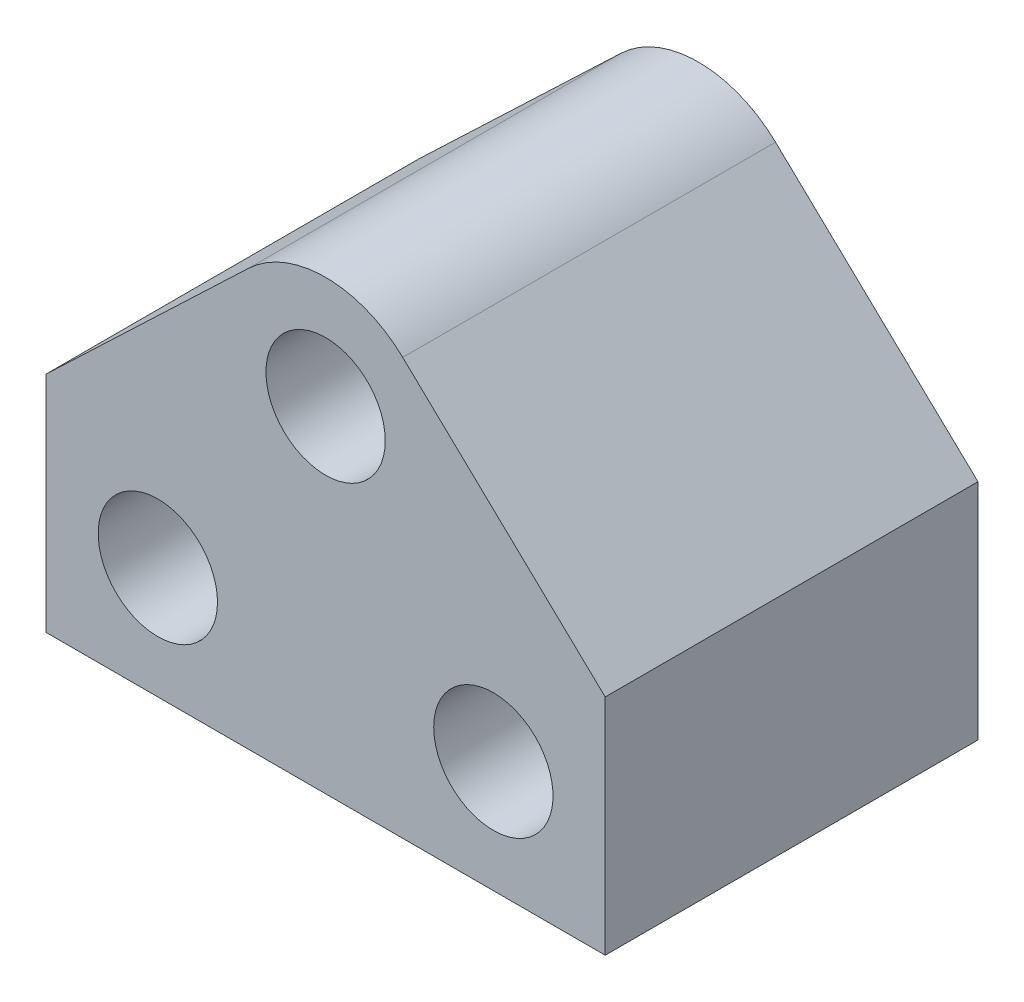
ISO-10303-21;
HEADER;
FILE_DESCRIPTION(('STEP AP214'),'2;1');
FILE_NAME('part.step','',(''),(''),'','','');
FILE_SCHEMA(('AUTOMOTIVE_DESIGN { 1 0 10303 214 1 1 1 1 }'));
ENDSEC;
DATA;
#1=APPLICATION_CONTEXT('core data for automotive mechanical design processes');
#2=APPLICATION_PROTOCOL_DEFINITION('international standard','automotive_design',2000,#1);
#3=PRODUCT_CONTEXT('',#1,'mechanical');
#4=PRODUCT('Part','Part','',(#3));
#5=PRODUCT_RELATED_PRODUCT_CATEGORY('part','',(#4));
#6=PRODUCT_DEFINITION_FORMATION('','',#4);
#7=PRODUCT_DEFINITION_CONTEXT('part definition',#1,'design');
#8=PRODUCT_DEFINITION('design','',#6,#7);
#9=PRODUCT_DEFINITION_SHAPE('','',#8);
#10=(LENGTH_UNIT() NAMED_UNIT(*) SI_UNIT(.MILLI.,.METRE.));
#11=(NAMED_UNIT(*) PLANE_ANGLE_UNIT() SI_UNIT($,.RADIAN.));
#12=(NAMED_UNIT(*) SI_UNIT($,.STERADIAN.) SOLID_ANGLE_UNIT());
#13=UNCERTAINTY_MEASURE_WITH_UNIT(LENGTH_MEASURE(1.E-05),#10,'distance_accuracy_value','');
#14=(GEOMETRIC_REPRESENTATION_CONTEXT(3) GLOBAL_UNCERTAINTY_ASSIGNED_CONTEXT((#13)) GLOBAL_UNIT_ASSIGNED_CONTEXT((#10,
#11,#12)) REPRESENTATION_CONTEXT('',''));
#15=CARTESIAN_POINT('',(0.,0.,0.));
#16=DIRECTION('',(0.,0.,1.));
#17=DIRECTION('',(1.,0.,0.));
#18=AXIS2_PLACEMENT_3D('',#15,#16,#17);
#19=CARTESIAN_POINT('',(0.,9.,10.));
#20=DIRECTION('',(0.,0.,-1.));
#21=DIRECTION('',(-1.,0.,0.));
#22=AXIS2_PLACEMENT_3D('',#19,#20,#21);
#23=PLANE('',#22);
#24=DIRECTION('',(0.,-1.,0.));
#25=VECTOR('',#24,1.);
#26=CARTESIAN_POINT('',(-7.49999999999999,0.,10.));
#27=LINE('',#26,#25);
#28=CARTESIAN_POINT('',(-7.49999999999999,6.,10.));
#29=VERTEX_POINT('',#28);
#30=CARTESIAN_POINT('',(-7.49999999999999,0.,10.));
#31=VERTEX_POINT('',#30);
#32=EDGE_CURVE('E152',#29,#31,#27,.T.);
#33=ORIENTED_EDGE('',*,*,#32,.T.);
#34=DIRECTION('',(1.,0.,0.));
#35=VECTOR('',#34,1.);
#36=CARTESIAN_POINT('',(7.50000000000001,0.,10.));
#37=LINE('',#36,#35);
#38=CARTESIAN_POINT('',(7.50000000000001,0.,10.));
#39=VERTEX_POINT('',#38);
#40=EDGE_CURVE('E100',#31,#39,#37,.T.);
#41=ORIENTED_EDGE('',*,*,#40,.T.);
#42=DIRECTION('',(0.,1.,0.));
#43=VECTOR('',#42,1.);
#44=CARTESIAN_POINT('',(7.50000000000001,0.,10.));
#45=LINE('',#44,#43);
#46=CARTESIAN_POINT('',(7.50000000000001,6.,10.));
#47=VERTEX_POINT('',#46);
#48=EDGE_CURVE('E113',#39,#47,#45,.T.);
#49=ORIENTED_EDGE('',*,*,#48,.T.);
#50=DIRECTION('',(-0.724137931034482,0.689655172413794,0.));
#51=VECTOR('',#50,1.);
#52=CARTESIAN_POINT('',(2.0689655172414,11.1724137931035,10.));
#53=LINE('',#52,#51);
#54=CARTESIAN_POINT('',(2.0689655172414,11.1724137931035,10.));
#55=VERTEX_POINT('',#54);
#56=EDGE_CURVE('E107',#47,#55,#53,.T.);
#57=ORIENTED_EDGE('',*,*,#56,.T.);
#58=CARTESIAN_POINT('',(0.,9.,10.));
#59=DIRECTION('',(0.,0.,1.));
#60=DIRECTION('',(-1.,0.,0.));
#61=AXIS2_PLACEMENT_3D('',#58,#59,#60);
#62=CIRCLE('',#61,3.00000000000001);
#63=CARTESIAN_POINT('',(-2.06896551724138,11.1724137931035,10.));
#64=VERTEX_POINT('',#63);
#65=EDGE_CURVE('E111',#55,#64,#62,.T.);
#66=ORIENTED_EDGE('',*,*,#65,.T.);
#67=DIRECTION('',(-0.724137931034482,-0.689655172413794,0.));
#68=VECTOR('',#67,1.);
#69=CARTESIAN_POINT('',(-7.49999999999999,6.,10.));
#70=LINE('',#69,#68);
#71=EDGE_CURVE('E63',#64,#29,#70,.T.);
#72=ORIENTED_EDGE('',*,*,#71,.T.);
#73=EDGE_LOOP('',(#33,#41,#49,#57,#66,#72));
#74=FACE_BOUND('',#73,.T.);
#75=CARTESIAN_POINT('',(-4.49999999999999,3.,10.));
#76=DIRECTION('',(0.,0.,1.));
#77=DIRECTION('',(1.,0.,0.));
#78=AXIS2_PLACEMENT_3D('',#75,#76,#77);
#79=CIRCLE('',#78,1.6);
#80=CARTESIAN_POINT('',(-2.89999999999999,3.,10.));
#81=VERTEX_POINT('',#80);
#82=EDGE_CURVE('E140',#81,#81,#79,.T.);
#83=ORIENTED_EDGE('',*,*,#82,.F.);
#84=EDGE_LOOP('',(#83));
#85=FACE_BOUND('',#84,.T.);
#86=CARTESIAN_POINT('',(0.,9.,10.));
#87=DIRECTION('',(0.,0.,1.));
#88=DIRECTION('',(1.,0.,0.));
#89=AXIS2_PLACEMENT_3D('',#86,#87,#88);
#90=CIRCLE('',#89,1.6);
#91=CARTESIAN_POINT('',(1.60000000000001,9.,10.));
#92=VERTEX_POINT('',#91);
#93=EDGE_CURVE('E212',#92,#92,#90,.T.);
#94=ORIENTED_EDGE('',*,*,#93,.F.);
#95=EDGE_LOOP('',(#94));
#96=FACE_BOUND('',#95,.T.);
#97=CARTESIAN_POINT('',(4.5,3.,10.));
#98=DIRECTION('',(0.,0.,1.));
#99=DIRECTION('',(-1.,0.,0.));
#100=AXIS2_PLACEMENT_3D('',#97,#98,#99);
#101=CIRCLE('',#100,1.6);
#102=CARTESIAN_POINT('',(2.9,3.,10.));
#103=VERTEX_POINT('',#102);
#104=EDGE_CURVE('E201',#103,#103,#101,.T.);
#105=ORIENTED_EDGE('',*,*,#104,.F.);
#106=EDGE_LOOP('',(#105));
#107=FACE_BOUND('',#106,.T.);
#108=ADVANCED_FACE('F45',(#74,#85,#96,#107),#23,.F.);
#109=CARTESIAN_POINT('',(0.,9.,0.));
#110=DIRECTION('',(0.,0.,-1.));
#111=DIRECTION('',(-1.,0.,0.));
#112=AXIS2_PLACEMENT_3D('',#109,#110,#111);
#113=PLANE('',#112);
#114=CARTESIAN_POINT('',(0.,9.,0.));
#115=DIRECTION('',(0.,0.,1.));
#116=DIRECTION('',(1.,0.,0.));
#117=AXIS2_PLACEMENT_3D('',#114,#115,#116);
#118=CIRCLE('',#117,1.6);
#119=CARTESIAN_POINT('',(1.60000000000001,9.,0.));
#120=VERTEX_POINT('',#119);
#121=EDGE_CURVE('E209',#120,#120,#118,.T.);
#122=ORIENTED_EDGE('',*,*,#121,.T.);
#123=EDGE_LOOP('',(#122));
#124=FACE_BOUND('',#123,.T.);
#125=DIRECTION('',(0.,-1.,0.));
#126=VECTOR('',#125,1.);
#127=CARTESIAN_POINT('',(-7.49999999999999,0.,0.));
#128=LINE('',#127,#126);
#129=CARTESIAN_POINT('',(-7.49999999999999,6.,0.));
#130=VERTEX_POINT('',#129);
#131=CARTESIAN_POINT('',(-7.49999999999999,0.,0.));
#132=VERTEX_POINT('',#131);
#133=EDGE_CURVE('E135',#130,#132,#128,.T.);
#134=ORIENTED_EDGE('',*,*,#133,.F.);
#135=DIRECTION('',(-0.724137931034482,-0.689655172413794,0.));
#136=VECTOR('',#135,1.);
#137=CARTESIAN_POINT('',(-7.49999999999999,6.,0.));
#138=LINE('',#137,#136);
#139=CARTESIAN_POINT('',(-2.06896551724138,11.1724137931035,0.));
#140=VERTEX_POINT('',#139);
#141=EDGE_CURVE('E92',#140,#130,#138,.T.);
#142=ORIENTED_EDGE('',*,*,#141,.F.);
#143=CARTESIAN_POINT('',(0.,9.,0.));
#144=DIRECTION('',(0.,0.,1.));
#145=DIRECTION('',(-1.,0.,0.));
#146=AXIS2_PLACEMENT_3D('',#143,#144,#145);
#147=CIRCLE('',#146,3.00000000000001);
#148=CARTESIAN_POINT('',(2.0689655172414,11.1724137931035,0.));
#149=VERTEX_POINT('',#148);
#150=EDGE_CURVE('E86',#149,#140,#147,.T.);
#151=ORIENTED_EDGE('',*,*,#150,.F.);
#152=DIRECTION('',(-0.724137931034482,0.689655172413794,0.));
#153=VECTOR('',#152,1.);
#154=CARTESIAN_POINT('',(2.0689655172414,11.1724137931035,0.));
#155=LINE('',#154,#153);
#156=CARTESIAN_POINT('',(7.50000000000001,6.,0.));
#157=VERTEX_POINT('',#156);
#158=EDGE_CURVE('E122',#157,#149,#155,.T.);
#159=ORIENTED_EDGE('',*,*,#158,.F.);
#160=DIRECTION('',(0.,1.,0.));
#161=VECTOR('',#160,1.);
#162=CARTESIAN_POINT('',(7.50000000000001,0.,0.));
#163=LINE('',#162,#161);
#164=CARTESIAN_POINT('',(7.50000000000001,0.,0.));
#165=VERTEX_POINT('',#164);
#166=EDGE_CURVE('E143',#165,#157,#163,.T.);
#167=ORIENTED_EDGE('',*,*,#166,.F.);
#168=DIRECTION('',(1.,0.,0.));
#169=VECTOR('',#168,1.);
#170=CARTESIAN_POINT('',(7.50000000000001,0.,0.));
#171=LINE('',#170,#169);
#172=EDGE_CURVE('E139',#132,#165,#171,.T.);
#173=ORIENTED_EDGE('',*,*,#172,.F.);
#174=EDGE_LOOP('',(#134,#142,#151,#159,#167,#173));
#175=FACE_BOUND('',#174,.T.);
#176=CARTESIAN_POINT('',(-4.49999999999999,3.,0.));
#177=DIRECTION('',(0.,0.,1.));
#178=DIRECTION('',(1.,0.,0.));
#179=AXIS2_PLACEMENT_3D('',#176,#177,#178);
#180=CIRCLE('',#179,1.6);
#181=CARTESIAN_POINT('',(-2.89999999999999,3.,0.));
#182=VERTEX_POINT('',#181);
#183=EDGE_CURVE('E216',#182,#182,#180,.T.);
#184=ORIENTED_EDGE('',*,*,#183,.T.);
#185=EDGE_LOOP('',(#184));
#186=FACE_BOUND('',#185,.T.);
#187=CARTESIAN_POINT('',(4.5,3.,0.));
#188=DIRECTION('',(0.,0.,1.));
#189=DIRECTION('',(-1.,0.,0.));
#190=AXIS2_PLACEMENT_3D('',#187,#188,#189);
#191=CIRCLE('',#190,1.6);
#192=CARTESIAN_POINT('',(2.9,3.,0.));
#193=VERTEX_POINT('',#192);
#194=EDGE_CURVE('E204',#193,#193,#191,.T.);
#195=ORIENTED_EDGE('',*,*,#194,.T.);
#196=EDGE_LOOP('',(#195));
#197=FACE_BOUND('',#196,.T.);
#198=ADVANCED_FACE('F165',(#124,#175,#186,#197),#113,.T.);
#199=CARTESIAN_POINT('',(-7.49999999999999,0.,10.));
#200=DIRECTION('',(1.,0.,0.));
#201=DIRECTION('',(0.,0.,-1.));
#202=AXIS2_PLACEMENT_3D('',#199,#200,#201);
#203=PLANE('',#202);
#204=ORIENTED_EDGE('',*,*,#133,.T.);
#205=DIRECTION('',(0.,0.,-1.));
#206=VECTOR('',#205,1.);
#207=CARTESIAN_POINT('',(-7.49999999999999,0.,10.));
#208=LINE('',#207,#206);
#209=EDGE_CURVE('E11',#31,#132,#208,.T.);
#210=ORIENTED_EDGE('',*,*,#209,.F.);
#211=ORIENTED_EDGE('',*,*,#32,.F.);
#212=DIRECTION('',(0.,0.,-1.));
#213=VECTOR('',#212,1.);
#214=CARTESIAN_POINT('',(-7.49999999999999,6.,10.));
#215=LINE('',#214,#213);
#216=EDGE_CURVE('E131',#29,#130,#215,.T.);
#217=ORIENTED_EDGE('',*,*,#216,.T.);
#218=EDGE_LOOP('',(#204,#210,#211,#217));
#219=FACE_BOUND('',#218,.T.);
#220=ADVANCED_FACE('F47',(#219),#203,.F.);
#221=CARTESIAN_POINT('',(7.50000000000001,0.,10.));
#222=DIRECTION('',(0.,1.,0.));
#223=DIRECTION('',(0.,0.,1.));
#224=AXIS2_PLACEMENT_3D('',#221,#222,#223);
#225=PLANE('',#224);
#226=ORIENTED_EDGE('',*,*,#172,.T.);
#227=DIRECTION('',(0.,0.,-1.));
#228=VECTOR('',#227,1.);
#229=CARTESIAN_POINT('',(7.50000000000001,0.,10.));
#230=LINE('',#229,#228);
#231=EDGE_CURVE('E55',#39,#165,#230,.T.);
#232=ORIENTED_EDGE('',*,*,#231,.F.);
#233=ORIENTED_EDGE('',*,*,#40,.F.);
#234=ORIENTED_EDGE('',*,*,#209,.T.);
#235=EDGE_LOOP('',(#226,#232,#233,#234));
#236=FACE_BOUND('',#235,.T.);
#237=ADVANCED_FACE('F276',(#236),#225,.F.);
#238=CARTESIAN_POINT('',(7.50000000000001,0.,10.));
#239=DIRECTION('',(-1.,0.,0.));
#240=DIRECTION('',(0.,0.,1.));
#241=AXIS2_PLACEMENT_3D('',#238,#239,#240);
#242=PLANE('',#241);
#243=ORIENTED_EDGE('',*,*,#166,.T.);
#244=DIRECTION('',(0.,0.,-1.));
#245=VECTOR('',#244,1.);
#246=CARTESIAN_POINT('',(7.50000000000001,6.,10.));
#247=LINE('',#246,#245);
#248=EDGE_CURVE('E124',#47,#157,#247,.T.);
#249=ORIENTED_EDGE('',*,*,#248,.F.);
#250=ORIENTED_EDGE('',*,*,#48,.F.);
#251=ORIENTED_EDGE('',*,*,#231,.T.);
#252=EDGE_LOOP('',(#243,#249,#250,#251));
#253=FACE_BOUND('',#252,.T.);
#254=ADVANCED_FACE('F162',(#253),#242,.F.);
#255=CARTESIAN_POINT('',(2.0689655172414,11.1724137931035,10.));
#256=DIRECTION('',(-0.689655172413794,-0.724137931034482,0.));
#257=DIRECTION('',(0.724137931034482,-0.689655172413794,0.));
#258=AXIS2_PLACEMENT_3D('',#255,#256,#257);
#259=PLANE('',#258);
#260=ORIENTED_EDGE('',*,*,#158,.T.);
#261=DIRECTION('',(0.,0.,-1.));
#262=VECTOR('',#261,1.);
#263=CARTESIAN_POINT('',(2.0689655172414,11.1724137931035,10.));
#264=LINE('',#263,#262);
#265=EDGE_CURVE('E119',#55,#149,#264,.T.);
#266=ORIENTED_EDGE('',*,*,#265,.F.);
#267=ORIENTED_EDGE('',*,*,#56,.F.);
#268=ORIENTED_EDGE('',*,*,#248,.T.);
#269=EDGE_LOOP('',(#260,#266,#267,#268));
#270=FACE_BOUND('',#269,.T.);
#271=ADVANCED_FACE('F120',(#270),#259,.F.);
#272=CARTESIAN_POINT('',(0.,9.,10.));
#273=DIRECTION('',(0.,0.,-1.));
#274=DIRECTION('',(-1.,0.,0.));
#275=AXIS2_PLACEMENT_3D('',#272,#273,#274);
#276=CYLINDRICAL_SURFACE('',#275,3.00000000000001);
#277=ORIENTED_EDGE('',*,*,#150,.T.);
#278=DIRECTION('',(0.,0.,-1.));
#279=VECTOR('',#278,1.);
#280=CARTESIAN_POINT('',(-2.06896551724138,11.1724137931035,10.));
#281=LINE('',#280,#279);
#282=EDGE_CURVE('E125',#64,#140,#281,.T.);
#283=ORIENTED_EDGE('',*,*,#282,.F.);
#284=ORIENTED_EDGE('',*,*,#65,.F.);
#285=ORIENTED_EDGE('',*,*,#265,.T.);
#286=EDGE_LOOP('',(#277,#283,#284,#285));
#287=FACE_BOUND('',#286,.T.);
#288=ADVANCED_FACE('F127',(#287),#276,.T.);
#289=CARTESIAN_POINT('',(-7.49999999999999,6.,10.));
#290=DIRECTION('',(0.689655172413794,-0.724137931034482,0.));
#291=DIRECTION('',(0.724137931034482,0.689655172413794,0.));
#292=AXIS2_PLACEMENT_3D('',#289,#290,#291);
#293=PLANE('',#292);
#294=ORIENTED_EDGE('',*,*,#141,.T.);
#295=ORIENTED_EDGE('',*,*,#216,.F.);
#296=ORIENTED_EDGE('',*,*,#71,.F.);
#297=ORIENTED_EDGE('',*,*,#282,.T.);
#298=EDGE_LOOP('',(#294,#295,#296,#297));
#299=FACE_BOUND('',#298,.T.);
#300=ADVANCED_FACE('F170',(#299),#293,.F.);
#301=CARTESIAN_POINT('',(-4.49999999999999,3.,10.));
#302=DIRECTION('',(0.,0.,-1.));
#303=DIRECTION('',(-1.,0.,0.));
#304=AXIS2_PLACEMENT_3D('',#301,#302,#303);
#305=CYLINDRICAL_SURFACE('',#304,1.6);
#306=ORIENTED_EDGE('',*,*,#82,.T.);
#307=EDGE_LOOP('',(#306));
#308=FACE_BOUND('',#307,.T.);
#309=ORIENTED_EDGE('',*,*,#183,.F.);
#310=EDGE_LOOP('',(#309));
#311=FACE_BOUND('',#310,.T.);
#312=ADVANCED_FACE('F172',(#308,#311),#305,.F.);
#313=CARTESIAN_POINT('',(0.,9.,10.));
#314=DIRECTION('',(0.,0.,-1.));
#315=DIRECTION('',(-1.,0.,0.));
#316=AXIS2_PLACEMENT_3D('',#313,#314,#315);
#317=CYLINDRICAL_SURFACE('',#316,1.6);
#318=ORIENTED_EDGE('',*,*,#93,.T.);
#319=EDGE_LOOP('',(#318));
#320=FACE_BOUND('',#319,.T.);
#321=ORIENTED_EDGE('',*,*,#121,.F.);
#322=EDGE_LOOP('',(#321));
#323=FACE_BOUND('',#322,.T.);
#324=ADVANCED_FACE('F178',(#320,#323),#317,.F.);
#325=CARTESIAN_POINT('',(4.5,3.,10.));
#326=DIRECTION('',(0.,0.,-1.));
#327=DIRECTION('',(-1.,0.,0.));
#328=AXIS2_PLACEMENT_3D('',#325,#326,#327);
#329=CYLINDRICAL_SURFACE('',#328,1.6);
#330=ORIENTED_EDGE('',*,*,#104,.T.);
#331=EDGE_LOOP('',(#330));
#332=FACE_BOUND('',#331,.T.);
#333=ORIENTED_EDGE('',*,*,#194,.F.);
#334=EDGE_LOOP('',(#333));
#335=FACE_BOUND('',#334,.T.);
#336=ADVANCED_FACE('F192',(#332,#335),#329,.F.);
#337=CLOSED_SHELL('',(#108,#198,#220,#237,#254,#271,#288,#300,#312,#324,#336));
#338=MANIFOLD_SOLID_BREP('B2',#337);
#339=ADVANCED_BREP_SHAPE_REPRESENTATION('',(#18,#338),#14);
#340=SHAPE_DEFINITION_REPRESENTATION(#9,#339);
ENDSEC;
END-ISO-10303-21;
